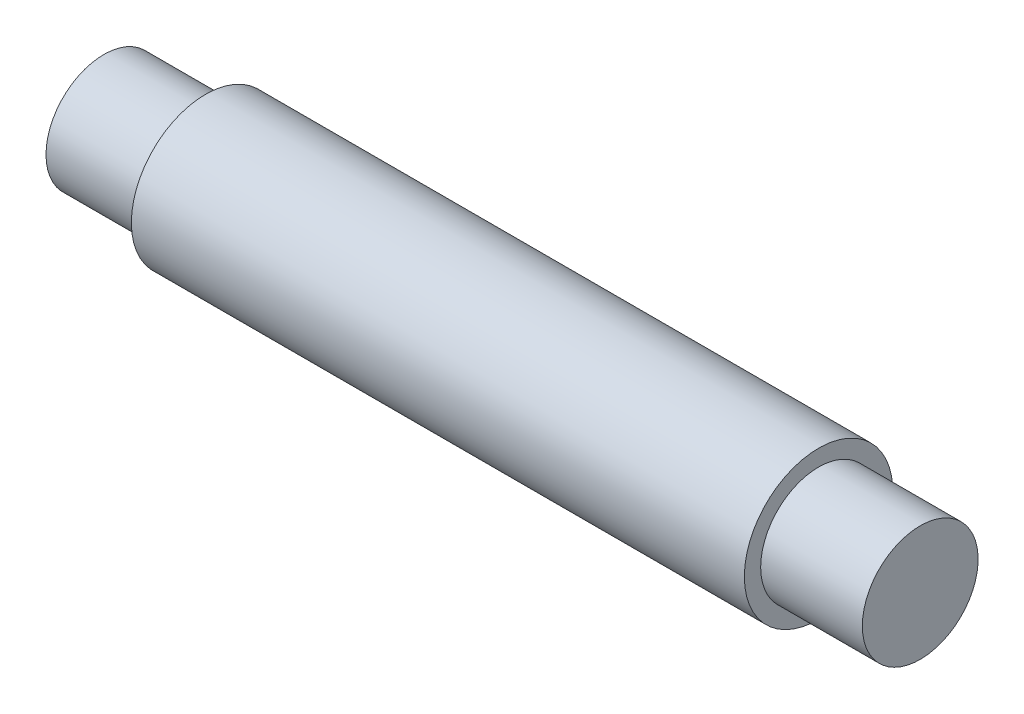
ISO-10303-21;
HEADER;
FILE_DESCRIPTION(('STEP AP214'),'2;1');
FILE_NAME('part.step','',(''),(''),'','','');
FILE_SCHEMA(('AUTOMOTIVE_DESIGN { 1 0 10303 214 1 1 1 1 }'));
ENDSEC;
DATA;
#1=APPLICATION_CONTEXT('core data for automotive mechanical design processes');
#2=APPLICATION_PROTOCOL_DEFINITION('international standard','automotive_design',2000,#1);
#3=PRODUCT_CONTEXT('',#1,'mechanical');
#4=PRODUCT('Part','Part','',(#3));
#5=PRODUCT_RELATED_PRODUCT_CATEGORY('part','',(#4));
#6=PRODUCT_DEFINITION_FORMATION('','',#4);
#7=PRODUCT_DEFINITION_CONTEXT('part definition',#1,'design');
#8=PRODUCT_DEFINITION('design','',#6,#7);
#9=PRODUCT_DEFINITION_SHAPE('','',#8);
#10=(LENGTH_UNIT() NAMED_UNIT(*) SI_UNIT(.MILLI.,.METRE.));
#11=(NAMED_UNIT(*) PLANE_ANGLE_UNIT() SI_UNIT($,.RADIAN.));
#12=(NAMED_UNIT(*) SI_UNIT($,.STERADIAN.) SOLID_ANGLE_UNIT());
#13=UNCERTAINTY_MEASURE_WITH_UNIT(LENGTH_MEASURE(1.E-05),#10,'distance_accuracy_value','');
#14=(GEOMETRIC_REPRESENTATION_CONTEXT(3) GLOBAL_UNCERTAINTY_ASSIGNED_CONTEXT((#13)) GLOBAL_UNIT_ASSIGNED_CONTEXT((#10,
#11,#12)) REPRESENTATION_CONTEXT('',''));
#15=CARTESIAN_POINT('',(0.,0.,0.));
#16=DIRECTION('',(0.,0.,1.));
#17=DIRECTION('',(1.,0.,0.));
#18=AXIS2_PLACEMENT_3D('',#15,#16,#17);
#19=CARTESIAN_POINT('',(20.65,-40.5977945737239,0.));
#20=DIRECTION('',(1.,0.,0.));
#21=DIRECTION('',(0.,0.,-1.));
#22=AXIS2_PLACEMENT_3D('',#19,#20,#21);
#23=PLANE('',#22);
#24=CARTESIAN_POINT('',(20.65,0.,0.));
#25=DIRECTION('',(-1.,0.,0.));
#26=DIRECTION('',(0.,0.,1.));
#27=AXIS2_PLACEMENT_3D('',#24,#25,#26);
#28=CIRCLE('',#27,3.9);
#29=CARTESIAN_POINT('',(20.65,0.,3.9));
#30=VERTEX_POINT('',#29);
#31=EDGE_CURVE('E53',#30,#30,#28,.T.);
#32=ORIENTED_EDGE('',*,*,#31,.T.);
#33=EDGE_LOOP('',(#32));
#34=FACE_BOUND('',#33,.T.);
#35=CARTESIAN_POINT('',(20.65,0.,0.));
#36=DIRECTION('',(-1.,0.,0.));
#37=DIRECTION('',(0.,0.,1.));
#38=AXIS2_PLACEMENT_3D('',#35,#36,#37);
#39=CIRCLE('',#38,5.);
#40=CARTESIAN_POINT('',(20.65,0.,5.));
#41=VERTEX_POINT('',#40);
#42=EDGE_CURVE('E10',#41,#41,#39,.T.);
#43=ORIENTED_EDGE('',*,*,#42,.F.);
#44=EDGE_LOOP('',(#43));
#45=FACE_BOUND('',#44,.T.);
#46=ADVANCED_FACE('F31',(#34,#45),#23,.T.);
#47=CARTESIAN_POINT('',(-27.5,0.,0.));
#48=DIRECTION('',(-1.,0.,0.));
#49=DIRECTION('',(0.,0.,1.));
#50=AXIS2_PLACEMENT_3D('',#47,#48,#49);
#51=CYLINDRICAL_SURFACE('',#50,5.);
#52=ORIENTED_EDGE('',*,*,#42,.T.);
#53=EDGE_LOOP('',(#52));
#54=FACE_BOUND('',#53,.T.);
#55=CARTESIAN_POINT('',(-20.65,0.,0.));
#56=DIRECTION('',(-1.,0.,0.));
#57=DIRECTION('',(0.,0.,1.));
#58=AXIS2_PLACEMENT_3D('',#55,#56,#57);
#59=CIRCLE('',#58,5.);
#60=CARTESIAN_POINT('',(-20.65,0.,5.));
#61=VERTEX_POINT('',#60);
#62=EDGE_CURVE('E37',#61,#61,#59,.T.);
#63=ORIENTED_EDGE('',*,*,#62,.F.);
#64=EDGE_LOOP('',(#63));
#65=FACE_BOUND('',#64,.T.);
#66=ADVANCED_FACE('F71',(#54,#65),#51,.T.);
#67=CARTESIAN_POINT('',(-20.65,-40.5977945737239,0.));
#68=DIRECTION('',(1.,0.,0.));
#69=DIRECTION('',(0.,0.,-1.));
#70=AXIS2_PLACEMENT_3D('',#67,#68,#69);
#71=PLANE('',#70);
#72=CARTESIAN_POINT('',(-20.65,0.,0.));
#73=DIRECTION('',(-1.,0.,0.));
#74=DIRECTION('',(0.,0.,1.));
#75=AXIS2_PLACEMENT_3D('',#72,#73,#74);
#76=CIRCLE('',#75,3.9);
#77=CARTESIAN_POINT('',(-20.65,0.,3.9));
#78=VERTEX_POINT('',#77);
#79=EDGE_CURVE('E41',#78,#78,#76,.T.);
#80=ORIENTED_EDGE('',*,*,#79,.F.);
#81=EDGE_LOOP('',(#80));
#82=FACE_BOUND('',#81,.T.);
#83=ORIENTED_EDGE('',*,*,#62,.T.);
#84=EDGE_LOOP('',(#83));
#85=FACE_BOUND('',#84,.T.);
#86=ADVANCED_FACE('F75',(#82,#85),#71,.F.);
#87=CARTESIAN_POINT('',(-27.5,0.,0.));
#88=DIRECTION('',(-1.,0.,0.));
#89=DIRECTION('',(0.,0.,1.));
#90=AXIS2_PLACEMENT_3D('',#87,#88,#89);
#91=CYLINDRICAL_SURFACE('',#90,3.9);
#92=CARTESIAN_POINT('',(-27.5,0.,0.));
#93=DIRECTION('',(-1.,0.,0.));
#94=DIRECTION('',(0.,0.,1.));
#95=AXIS2_PLACEMENT_3D('',#92,#93,#94);
#96=CIRCLE('',#95,3.9);
#97=CARTESIAN_POINT('',(-27.5,0.,3.9));
#98=VERTEX_POINT('',#97);
#99=EDGE_CURVE('E45',#98,#98,#96,.T.);
#100=ORIENTED_EDGE('',*,*,#99,.F.);
#101=EDGE_LOOP('',(#100));
#102=FACE_BOUND('',#101,.T.);
#103=ORIENTED_EDGE('',*,*,#79,.T.);
#104=EDGE_LOOP('',(#103));
#105=FACE_BOUND('',#104,.T.);
#106=ADVANCED_FACE('F79',(#102,#105),#91,.T.);
#107=CARTESIAN_POINT('',(-27.5,-40.5977945737239,0.));
#108=DIRECTION('',(1.,0.,0.));
#109=DIRECTION('',(0.,0.,-1.));
#110=AXIS2_PLACEMENT_3D('',#107,#108,#109);
#111=PLANE('',#110);
#112=ORIENTED_EDGE('',*,*,#99,.T.);
#113=EDGE_LOOP('',(#112));
#114=FACE_BOUND('',#113,.T.);
#115=ADVANCED_FACE('F67',(#114),#111,.F.);
#116=CARTESIAN_POINT('',(27.5,-40.597794573724,0.));
#117=DIRECTION('',(1.,0.,0.));
#118=DIRECTION('',(0.,0.,-1.));
#119=AXIS2_PLACEMENT_3D('',#116,#117,#118);
#120=PLANE('',#119);
#121=CARTESIAN_POINT('',(27.5,0.,0.));
#122=DIRECTION('',(-1.,0.,0.));
#123=DIRECTION('',(0.,0.,1.));
#124=AXIS2_PLACEMENT_3D('',#121,#122,#123);
#125=CIRCLE('',#124,3.9);
#126=CARTESIAN_POINT('',(27.5,0.,3.9));
#127=VERTEX_POINT('',#126);
#128=EDGE_CURVE('E50',#127,#127,#125,.T.);
#129=ORIENTED_EDGE('',*,*,#128,.F.);
#130=EDGE_LOOP('',(#129));
#131=FACE_BOUND('',#130,.T.);
#132=ADVANCED_FACE('F61',(#131),#120,.T.);
#133=CARTESIAN_POINT('',(-27.5,0.,0.));
#134=DIRECTION('',(-1.,0.,0.));
#135=DIRECTION('',(0.,0.,1.));
#136=AXIS2_PLACEMENT_3D('',#133,#134,#135);
#137=CYLINDRICAL_SURFACE('',#136,3.9);
#138=ORIENTED_EDGE('',*,*,#128,.T.);
#139=EDGE_LOOP('',(#138));
#140=FACE_BOUND('',#139,.T.);
#141=ORIENTED_EDGE('',*,*,#31,.F.);
#142=EDGE_LOOP('',(#141));
#143=FACE_BOUND('',#142,.T.);
#144=ADVANCED_FACE('F59',(#140,#143),#137,.T.);
#145=CLOSED_SHELL('',(#46,#66,#86,#106,#115,#132,#144));
#146=MANIFOLD_SOLID_BREP('B2',#145);
#147=ADVANCED_BREP_SHAPE_REPRESENTATION('',(#18,#146),#14);
#148=SHAPE_DEFINITION_REPRESENTATION(#9,#147);
ENDSEC;
END-ISO-10303-21;
